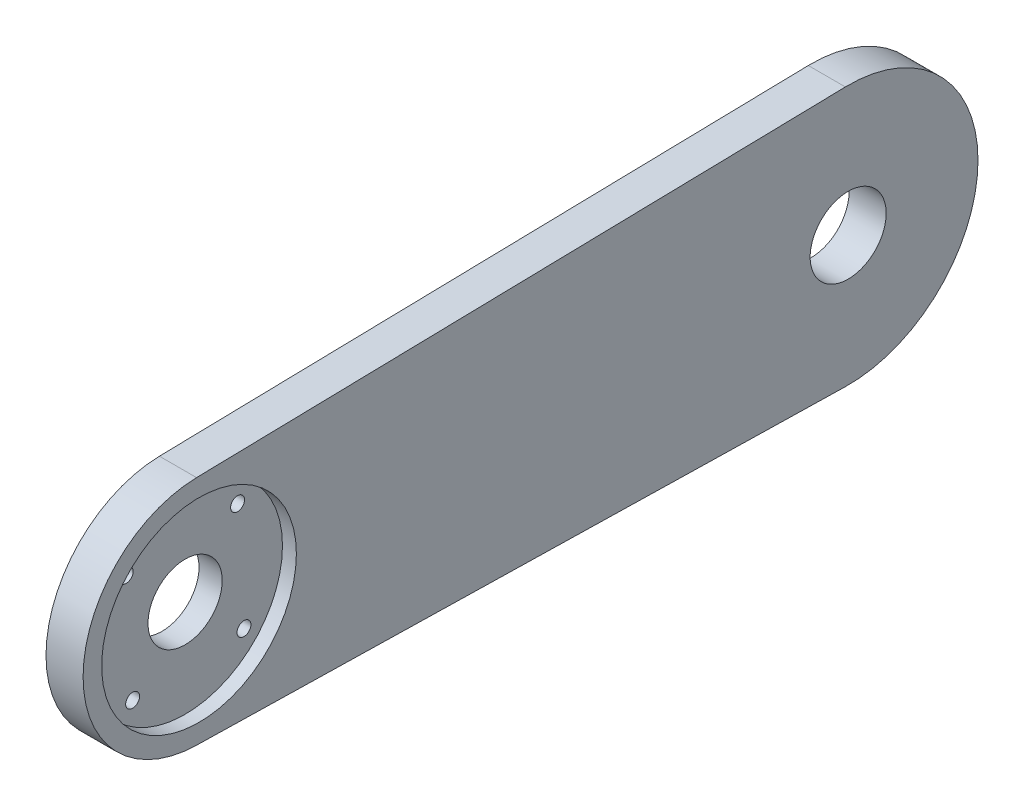
ISO-10303-21;
HEADER;
FILE_DESCRIPTION(('STEP AP214'),'2;1');
FILE_NAME('part.step','',(''),(''),'','','');
FILE_SCHEMA(('AUTOMOTIVE_DESIGN { 1 0 10303 214 1 1 1 1 }'));
ENDSEC;
DATA;
#1=APPLICATION_CONTEXT('core data for automotive mechanical design processes');
#2=APPLICATION_PROTOCOL_DEFINITION('international standard','automotive_design',2000,#1);
#3=PRODUCT_CONTEXT('',#1,'mechanical');
#4=PRODUCT('Part','Part','',(#3));
#5=PRODUCT_RELATED_PRODUCT_CATEGORY('part','',(#4));
#6=PRODUCT_DEFINITION_FORMATION('','',#4);
#7=PRODUCT_DEFINITION_CONTEXT('part definition',#1,'design');
#8=PRODUCT_DEFINITION('design','',#6,#7);
#9=PRODUCT_DEFINITION_SHAPE('','',#8);
#10=(LENGTH_UNIT() NAMED_UNIT(*) SI_UNIT(.MILLI.,.METRE.));
#11=(NAMED_UNIT(*) PLANE_ANGLE_UNIT() SI_UNIT($,.RADIAN.));
#12=(NAMED_UNIT(*) SI_UNIT($,.STERADIAN.) SOLID_ANGLE_UNIT());
#13=UNCERTAINTY_MEASURE_WITH_UNIT(LENGTH_MEASURE(1.E-05),#10,'distance_accuracy_value','');
#14=(GEOMETRIC_REPRESENTATION_CONTEXT(3) GLOBAL_UNCERTAINTY_ASSIGNED_CONTEXT((#13)) GLOBAL_UNIT_ASSIGNED_CONTEXT((#10,
#11,#12)) REPRESENTATION_CONTEXT('',''));
#15=CARTESIAN_POINT('',(0.,0.,0.));
#16=DIRECTION('',(0.,0.,1.));
#17=DIRECTION('',(1.,0.,0.));
#18=AXIS2_PLACEMENT_3D('',#15,#16,#17);
#19=CARTESIAN_POINT('',(4.,0.,70.));
#20=DIRECTION('',(-1.,0.,0.));
#21=DIRECTION('',(0.,0.,1.));
#22=AXIS2_PLACEMENT_3D('',#19,#20,#21);
#23=CYLINDRICAL_SURFACE('',#22,4.00000000000001);
#24=CARTESIAN_POINT('',(0.,0.,70.));
#25=DIRECTION('',(1.,0.,0.));
#26=DIRECTION('',(0.,0.,-1.));
#27=AXIS2_PLACEMENT_3D('',#24,#25,#26);
#28=CIRCLE('',#27,4.00000000000001);
#29=CARTESIAN_POINT('',(0.,0.,66.));
#30=VERTEX_POINT('',#29);
#31=EDGE_CURVE('E112',#30,#30,#28,.T.);
#32=ORIENTED_EDGE('',*,*,#31,.F.);
#33=EDGE_LOOP('',(#32));
#34=FACE_BOUND('',#33,.T.);
#35=CARTESIAN_POINT('',(2.5,0.,70.));
#36=DIRECTION('',(1.,0.,0.));
#37=DIRECTION('',(0.,0.,-1.));
#38=AXIS2_PLACEMENT_3D('',#35,#36,#37);
#39=CIRCLE('',#38,4.00000000000001);
#40=CARTESIAN_POINT('',(2.5,0.,66.));
#41=VERTEX_POINT('',#40);
#42=EDGE_CURVE('E109',#41,#41,#39,.T.);
#43=ORIENTED_EDGE('',*,*,#42,.T.);
#44=EDGE_LOOP('',(#43));
#45=FACE_BOUND('',#44,.T.);
#46=ADVANCED_FACE('F33',(#34,#45),#23,.F.);
#47=CARTESIAN_POINT('',(4.,0.,70.));
#48=DIRECTION('',(1.,0.,0.));
#49=DIRECTION('',(0.,0.,-1.));
#50=AXIS2_PLACEMENT_3D('',#47,#48,#49);
#51=PLANE('',#50);
#52=CARTESIAN_POINT('',(4.,0.,70.));
#53=DIRECTION('',(1.,0.,0.));
#54=DIRECTION('',(0.,0.,-1.));
#55=AXIS2_PLACEMENT_3D('',#52,#53,#54);
#56=CIRCLE('',#55,10.5);
#57=CARTESIAN_POINT('',(4.,0.,59.5));
#58=VERTEX_POINT('',#57);
#59=EDGE_CURVE('E117',#58,#58,#56,.T.);
#60=ORIENTED_EDGE('',*,*,#59,.F.);
#61=EDGE_LOOP('',(#60));
#62=FACE_BOUND('',#61,.T.);
#63=CARTESIAN_POINT('',(4.,0.,0.));
#64=DIRECTION('',(1.,0.,0.));
#65=DIRECTION('',(0.,0.,-1.));
#66=AXIS2_PLACEMENT_3D('',#63,#64,#65);
#67=CIRCLE('',#66,4.1);
#68=CARTESIAN_POINT('',(4.,0.,-4.1));
#69=VERTEX_POINT('',#68);
#70=EDGE_CURVE('E103',#69,#69,#67,.T.);
#71=ORIENTED_EDGE('',*,*,#70,.F.);
#72=EDGE_LOOP('',(#71));
#73=FACE_BOUND('',#72,.T.);
#74=CARTESIAN_POINT('',(4.,0.,70.));
#75=DIRECTION('',(1.,0.,0.));
#76=DIRECTION('',(0.,0.,-1.));
#77=AXIS2_PLACEMENT_3D('',#74,#75,#76);
#78=CIRCLE('',#77,12.5);
#79=CARTESIAN_POINT('',(4.,12.4971297725126,70.2678571428571));
#80=VERTEX_POINT('',#79);
#81=CARTESIAN_POINT('',(4.,-12.4971297725126,70.2678571428571));
#82=VERTEX_POINT('',#81);
#83=EDGE_CURVE('E87',#80,#82,#78,.T.);
#84=ORIENTED_EDGE('',*,*,#83,.T.);
#85=DIRECTION('',(0.,-0.0214285714285713,-0.999770381801007));
#86=VECTOR('',#85,1.);
#87=CARTESIAN_POINT('',(4.,-12.4971297725126,70.2678571428571));
#88=LINE('',#87,#86);
#89=CARTESIAN_POINT('',(4.,-13.9967853452141,0.300000000000001));
#90=VERTEX_POINT('',#89);
#91=EDGE_CURVE('E82',#82,#90,#88,.T.);
#92=ORIENTED_EDGE('',*,*,#91,.T.);
#93=CARTESIAN_POINT('',(4.,0.,0.));
#94=DIRECTION('',(1.,0.,0.));
#95=DIRECTION('',(0.,0.,-1.));
#96=AXIS2_PLACEMENT_3D('',#93,#94,#95);
#97=CIRCLE('',#96,14.);
#98=CARTESIAN_POINT('',(4.,13.9967853452141,0.300000000000002));
#99=VERTEX_POINT('',#98);
#100=EDGE_CURVE('E85',#90,#99,#97,.T.);
#101=ORIENTED_EDGE('',*,*,#100,.T.);
#102=DIRECTION('',(0.,-0.0214285714285716,0.999770381801007));
#103=VECTOR('',#102,1.);
#104=CARTESIAN_POINT('',(4.,12.4971297725126,70.2678571428571));
#105=LINE('',#104,#103);
#106=EDGE_CURVE('E52',#99,#80,#105,.T.);
#107=ORIENTED_EDGE('',*,*,#106,.T.);
#108=EDGE_LOOP('',(#84,#92,#101,#107));
#109=FACE_BOUND('',#108,.T.);
#110=ADVANCED_FACE('F83',(#62,#73,#109),#51,.T.);
#111=CARTESIAN_POINT('',(0.,0.,70.));
#112=DIRECTION('',(1.,0.,0.));
#113=DIRECTION('',(0.,0.,-1.));
#114=AXIS2_PLACEMENT_3D('',#111,#112,#113);
#115=PLANE('',#114);
#116=CARTESIAN_POINT('',(0.,-6.3481083902204,75.6580933065838));
#117=DIRECTION('',(-1.,0.,0.));
#118=DIRECTION('',(0.,0.,1.));
#119=AXIS2_PLACEMENT_3D('',#116,#117,#118);
#120=CIRCLE('',#119,0.749999999999999);
#121=CARTESIAN_POINT('',(0.,-6.3481083902204,76.4080933065838));
#122=VERTEX_POINT('',#121);
#123=EDGE_CURVE('E134',#122,#122,#120,.T.);
#124=ORIENTED_EDGE('',*,*,#123,.F.);
#125=EDGE_LOOP('',(#124));
#126=FACE_BOUND('',#125,.T.);
#127=CARTESIAN_POINT('',(0.,6.34810839022073,64.3419066934157));
#128=DIRECTION('',(-1.,0.,0.));
#129=DIRECTION('',(0.,0.,1.));
#130=AXIS2_PLACEMENT_3D('',#127,#128,#129);
#131=CIRCLE('',#130,0.750000000000376);
#132=CARTESIAN_POINT('',(0.,6.34810839022073,65.0919066934161));
#133=VERTEX_POINT('',#132);
#134=EDGE_CURVE('E124',#133,#133,#131,.T.);
#135=ORIENTED_EDGE('',*,*,#134,.F.);
#136=EDGE_LOOP('',(#135));
#137=FACE_BOUND('',#136,.T.);
#138=CARTESIAN_POINT('',(0.,5.65809330658422,76.3481083902203));
#139=DIRECTION('',(-1.,0.,0.));
#140=DIRECTION('',(0.,0.,1.));
#141=AXIS2_PLACEMENT_3D('',#138,#139,#140);
#142=CIRCLE('',#141,0.749999999999999);
#143=CARTESIAN_POINT('',(0.,5.65809330658422,77.0981083902203));
#144=VERTEX_POINT('',#143);
#145=EDGE_CURVE('E121',#144,#144,#142,.T.);
#146=ORIENTED_EDGE('',*,*,#145,.F.);
#147=EDGE_LOOP('',(#146));
#148=FACE_BOUND('',#147,.T.);
#149=CARTESIAN_POINT('',(0.,-5.65809330658389,63.6518916097792));
#150=DIRECTION('',(-1.,0.,0.));
#151=DIRECTION('',(0.,0.,1.));
#152=AXIS2_PLACEMENT_3D('',#149,#150,#151);
#153=CIRCLE('',#152,0.750000000000361);
#154=CARTESIAN_POINT('',(0.,-5.65809330658389,64.4018916097796));
#155=VERTEX_POINT('',#154);
#156=EDGE_CURVE('E118',#155,#155,#153,.T.);
#157=ORIENTED_EDGE('',*,*,#156,.F.);
#158=EDGE_LOOP('',(#157));
#159=FACE_BOUND('',#158,.T.);
#160=CARTESIAN_POINT('',(0.,0.,0.));
#161=DIRECTION('',(1.,0.,0.));
#162=DIRECTION('',(0.,0.,-1.));
#163=AXIS2_PLACEMENT_3D('',#160,#161,#162);
#164=CIRCLE('',#163,4.1);
#165=CARTESIAN_POINT('',(0.,0.,-4.1));
#166=VERTEX_POINT('',#165);
#167=EDGE_CURVE('E145',#166,#166,#164,.T.);
#168=ORIENTED_EDGE('',*,*,#167,.T.);
#169=EDGE_LOOP('',(#168));
#170=FACE_BOUND('',#169,.T.);
#171=CARTESIAN_POINT('',(0.,0.,70.));
#172=DIRECTION('',(1.,0.,0.));
#173=DIRECTION('',(0.,0.,-1.));
#174=AXIS2_PLACEMENT_3D('',#171,#172,#173);
#175=CIRCLE('',#174,12.5);
#176=CARTESIAN_POINT('',(0.,12.4971297725126,70.2678571428571));
#177=VERTEX_POINT('',#176);
#178=CARTESIAN_POINT('',(0.,-12.4971297725126,70.2678571428571));
#179=VERTEX_POINT('',#178);
#180=EDGE_CURVE('E100',#177,#179,#175,.T.);
#181=ORIENTED_EDGE('',*,*,#180,.F.);
#182=DIRECTION('',(0.,-0.0214285714285716,0.999770381801007));
#183=VECTOR('',#182,1.);
#184=CARTESIAN_POINT('',(0.,12.4971297725126,70.2678571428571));
#185=LINE('',#184,#183);
#186=CARTESIAN_POINT('',(0.,13.9967853452141,0.300000000000002));
#187=VERTEX_POINT('',#186);
#188=EDGE_CURVE('E75',#187,#177,#185,.T.);
#189=ORIENTED_EDGE('',*,*,#188,.F.);
#190=CARTESIAN_POINT('',(0.,0.,0.));
#191=DIRECTION('',(1.,0.,0.));
#192=DIRECTION('',(0.,0.,-1.));
#193=AXIS2_PLACEMENT_3D('',#190,#191,#192);
#194=CIRCLE('',#193,14.);
#195=CARTESIAN_POINT('',(0.,-13.9967853452141,0.300000000000001));
#196=VERTEX_POINT('',#195);
#197=EDGE_CURVE('E69',#196,#187,#194,.T.);
#198=ORIENTED_EDGE('',*,*,#197,.F.);
#199=DIRECTION('',(0.,-0.0214285714285713,-0.999770381801007));
#200=VECTOR('',#199,1.);
#201=CARTESIAN_POINT('',(0.,-12.4971297725126,70.2678571428571));
#202=LINE('',#201,#200);
#203=EDGE_CURVE('E91',#179,#196,#202,.T.);
#204=ORIENTED_EDGE('',*,*,#203,.F.);
#205=EDGE_LOOP('',(#181,#189,#198,#204));
#206=FACE_BOUND('',#205,.T.);
#207=ORIENTED_EDGE('',*,*,#31,.T.);
#208=EDGE_LOOP('',(#207));
#209=FACE_BOUND('',#208,.T.);
#210=ADVANCED_FACE('F151',(#126,#137,#148,#159,#170,#206,#209),#115,.F.);
#211=CARTESIAN_POINT('',(4.,0.,70.));
#212=DIRECTION('',(-1.,0.,0.));
#213=DIRECTION('',(0.,0.,1.));
#214=AXIS2_PLACEMENT_3D('',#211,#212,#213);
#215=CYLINDRICAL_SURFACE('',#214,12.5);
#216=ORIENTED_EDGE('',*,*,#180,.T.);
#217=DIRECTION('',(-1.,0.,0.));
#218=VECTOR('',#217,1.);
#219=CARTESIAN_POINT('',(4.,-12.4971297725126,70.2678571428571));
#220=LINE('',#219,#218);
#221=EDGE_CURVE('E11',#82,#179,#220,.T.);
#222=ORIENTED_EDGE('',*,*,#221,.F.);
#223=ORIENTED_EDGE('',*,*,#83,.F.);
#224=DIRECTION('',(-1.,0.,0.));
#225=VECTOR('',#224,1.);
#226=CARTESIAN_POINT('',(4.,12.4971297725126,70.2678571428571));
#227=LINE('',#226,#225);
#228=EDGE_CURVE('E96',#80,#177,#227,.T.);
#229=ORIENTED_EDGE('',*,*,#228,.T.);
#230=EDGE_LOOP('',(#216,#222,#223,#229));
#231=FACE_BOUND('',#230,.T.);
#232=ADVANCED_FACE('F35',(#231),#215,.T.);
#233=CARTESIAN_POINT('',(4.,-12.4971297725126,70.2678571428571));
#234=DIRECTION('',(0.,0.999770381801007,-0.0214285714285713));
#235=DIRECTION('',(0.,0.0214285714285713,0.999770381801007));
#236=AXIS2_PLACEMENT_3D('',#233,#234,#235);
#237=PLANE('',#236);
#238=ORIENTED_EDGE('',*,*,#203,.T.);
#239=DIRECTION('',(-1.,0.,0.));
#240=VECTOR('',#239,1.);
#241=CARTESIAN_POINT('',(4.,-13.9967853452141,0.300000000000001));
#242=LINE('',#241,#240);
#243=EDGE_CURVE('E43',#90,#196,#242,.T.);
#244=ORIENTED_EDGE('',*,*,#243,.F.);
#245=ORIENTED_EDGE('',*,*,#91,.F.);
#246=ORIENTED_EDGE('',*,*,#221,.T.);
#247=EDGE_LOOP('',(#238,#244,#245,#246));
#248=FACE_BOUND('',#247,.T.);
#249=ADVANCED_FACE('F90',(#248),#237,.F.);
#250=CARTESIAN_POINT('',(4.,0.,0.));
#251=DIRECTION('',(-1.,0.,0.));
#252=DIRECTION('',(0.,0.,1.));
#253=AXIS2_PLACEMENT_3D('',#250,#251,#252);
#254=CYLINDRICAL_SURFACE('',#253,14.);
#255=ORIENTED_EDGE('',*,*,#197,.T.);
#256=DIRECTION('',(-1.,0.,0.));
#257=VECTOR('',#256,1.);
#258=CARTESIAN_POINT('',(4.,13.9967853452141,0.300000000000002));
#259=LINE('',#258,#257);
#260=EDGE_CURVE('E92',#99,#187,#259,.T.);
#261=ORIENTED_EDGE('',*,*,#260,.F.);
#262=ORIENTED_EDGE('',*,*,#100,.F.);
#263=ORIENTED_EDGE('',*,*,#243,.T.);
#264=EDGE_LOOP('',(#255,#261,#262,#263));
#265=FACE_BOUND('',#264,.T.);
#266=ADVANCED_FACE('F94',(#265),#254,.T.);
#267=CARTESIAN_POINT('',(4.,12.4971297725126,70.2678571428571));
#268=DIRECTION('',(0.,-0.999770381801007,-0.0214285714285716));
#269=DIRECTION('',(0.,0.0214285714285716,-0.999770381801007));
#270=AXIS2_PLACEMENT_3D('',#267,#268,#269);
#271=PLANE('',#270);
#272=ORIENTED_EDGE('',*,*,#188,.T.);
#273=ORIENTED_EDGE('',*,*,#228,.F.);
#274=ORIENTED_EDGE('',*,*,#106,.F.);
#275=ORIENTED_EDGE('',*,*,#260,.T.);
#276=EDGE_LOOP('',(#272,#273,#274,#275));
#277=FACE_BOUND('',#276,.T.);
#278=ADVANCED_FACE('F157',(#277),#271,.F.);
#279=CARTESIAN_POINT('',(4.,0.,0.));
#280=DIRECTION('',(-1.,0.,0.));
#281=DIRECTION('',(0.,0.,1.));
#282=AXIS2_PLACEMENT_3D('',#279,#280,#281);
#283=CYLINDRICAL_SURFACE('',#282,4.1);
#284=ORIENTED_EDGE('',*,*,#70,.T.);
#285=EDGE_LOOP('',(#284));
#286=FACE_BOUND('',#285,.T.);
#287=ORIENTED_EDGE('',*,*,#167,.F.);
#288=EDGE_LOOP('',(#287));
#289=FACE_BOUND('',#288,.T.);
#290=ADVANCED_FACE('F154',(#286,#289),#283,.F.);
#291=CARTESIAN_POINT('',(2.5,0.,70.));
#292=DIRECTION('',(1.,0.,0.));
#293=DIRECTION('',(0.,0.,-1.));
#294=AXIS2_PLACEMENT_3D('',#291,#292,#293);
#295=CYLINDRICAL_SURFACE('',#294,10.5);
#296=CARTESIAN_POINT('',(2.5,0.,70.));
#297=DIRECTION('',(1.,0.,0.));
#298=DIRECTION('',(0.,0.,-1.));
#299=AXIS2_PLACEMENT_3D('',#296,#297,#298);
#300=CIRCLE('',#299,10.5);
#301=CARTESIAN_POINT('',(2.5,0.,59.5));
#302=VERTEX_POINT('',#301);
#303=EDGE_CURVE('E113',#302,#302,#300,.T.);
#304=ORIENTED_EDGE('',*,*,#303,.F.);
#305=EDGE_LOOP('',(#304));
#306=FACE_BOUND('',#305,.T.);
#307=ORIENTED_EDGE('',*,*,#59,.T.);
#308=EDGE_LOOP('',(#307));
#309=FACE_BOUND('',#308,.T.);
#310=ADVANCED_FACE('F156',(#306,#309),#295,.F.);
#311=CARTESIAN_POINT('',(2.5,0.,70.));
#312=DIRECTION('',(1.,0.,0.));
#313=DIRECTION('',(0.,0.,-1.));
#314=AXIS2_PLACEMENT_3D('',#311,#312,#313);
#315=PLANE('',#314);
#316=CARTESIAN_POINT('',(2.5,-6.3481083902204,75.6580933065838));
#317=DIRECTION('',(1.,0.,0.));
#318=DIRECTION('',(0.,0.,-1.));
#319=AXIS2_PLACEMENT_3D('',#316,#317,#318);
#320=CIRCLE('',#319,0.749999999999999);
#321=CARTESIAN_POINT('',(2.5,-6.3481083902204,74.9080933065838));
#322=VERTEX_POINT('',#321);
#323=EDGE_CURVE('E37',#322,#322,#320,.T.);
#324=ORIENTED_EDGE('',*,*,#323,.F.);
#325=EDGE_LOOP('',(#324));
#326=FACE_BOUND('',#325,.T.);
#327=CARTESIAN_POINT('',(2.5,6.34810839022073,64.3419066934157));
#328=DIRECTION('',(1.,0.,0.));
#329=DIRECTION('',(0.,0.,-1.));
#330=AXIS2_PLACEMENT_3D('',#327,#328,#329);
#331=CIRCLE('',#330,0.750000000000376);
#332=CARTESIAN_POINT('',(2.5,6.34810839022073,63.5919066934153));
#333=VERTEX_POINT('',#332);
#334=EDGE_CURVE('E122',#333,#333,#331,.T.);
#335=ORIENTED_EDGE('',*,*,#334,.F.);
#336=EDGE_LOOP('',(#335));
#337=FACE_BOUND('',#336,.T.);
#338=CARTESIAN_POINT('',(2.5,5.65809330658422,76.3481083902203));
#339=DIRECTION('',(1.,0.,0.));
#340=DIRECTION('',(0.,0.,-1.));
#341=AXIS2_PLACEMENT_3D('',#338,#339,#340);
#342=CIRCLE('',#341,0.749999999999999);
#343=CARTESIAN_POINT('',(2.5,5.65809330658422,75.5981083902203));
#344=VERTEX_POINT('',#343);
#345=EDGE_CURVE('E119',#344,#344,#342,.T.);
#346=ORIENTED_EDGE('',*,*,#345,.F.);
#347=EDGE_LOOP('',(#346));
#348=FACE_BOUND('',#347,.T.);
#349=CARTESIAN_POINT('',(2.5,-5.65809330658389,63.6518916097792));
#350=DIRECTION('',(1.,0.,0.));
#351=DIRECTION('',(0.,0.,-1.));
#352=AXIS2_PLACEMENT_3D('',#349,#350,#351);
#353=CIRCLE('',#352,0.750000000000361);
#354=CARTESIAN_POINT('',(2.5,-5.65809330658389,62.9018916097788));
#355=VERTEX_POINT('',#354);
#356=EDGE_CURVE('E114',#355,#355,#353,.T.);
#357=ORIENTED_EDGE('',*,*,#356,.F.);
#358=EDGE_LOOP('',(#357));
#359=FACE_BOUND('',#358,.T.);
#360=ORIENTED_EDGE('',*,*,#42,.F.);
#361=EDGE_LOOP('',(#360));
#362=FACE_BOUND('',#361,.T.);
#363=ORIENTED_EDGE('',*,*,#303,.T.);
#364=EDGE_LOOP('',(#363));
#365=FACE_BOUND('',#364,.T.);
#366=ADVANCED_FACE('F164',(#326,#337,#348,#359,#362,#365),#315,.T.);
#367=CARTESIAN_POINT('',(10.,-5.65809330658389,63.6518916097792));
#368=DIRECTION('',(-1.,0.,0.));
#369=DIRECTION('',(0.,0.,1.));
#370=AXIS2_PLACEMENT_3D('',#367,#368,#369);
#371=CYLINDRICAL_SURFACE('',#370,0.750000000000361);
#372=ORIENTED_EDGE('',*,*,#356,.T.);
#373=EDGE_LOOP('',(#372));
#374=FACE_BOUND('',#373,.T.);
#375=ORIENTED_EDGE('',*,*,#156,.T.);
#376=EDGE_LOOP('',(#375));
#377=FACE_BOUND('',#376,.T.);
#378=ADVANCED_FACE('F181',(#374,#377),#371,.F.);
#379=CARTESIAN_POINT('',(10.,5.65809330658422,76.3481083902203));
#380=DIRECTION('',(-1.,0.,0.));
#381=DIRECTION('',(0.,0.,1.));
#382=AXIS2_PLACEMENT_3D('',#379,#380,#381);
#383=CYLINDRICAL_SURFACE('',#382,0.749999999999999);
#384=ORIENTED_EDGE('',*,*,#345,.T.);
#385=EDGE_LOOP('',(#384));
#386=FACE_BOUND('',#385,.T.);
#387=ORIENTED_EDGE('',*,*,#145,.T.);
#388=EDGE_LOOP('',(#387));
#389=FACE_BOUND('',#388,.T.);
#390=ADVANCED_FACE('F185',(#386,#389),#383,.F.);
#391=CARTESIAN_POINT('',(10.,6.34810839022073,64.3419066934157));
#392=DIRECTION('',(-1.,0.,0.));
#393=DIRECTION('',(0.,0.,1.));
#394=AXIS2_PLACEMENT_3D('',#391,#392,#393);
#395=CYLINDRICAL_SURFACE('',#394,0.750000000000376);
#396=ORIENTED_EDGE('',*,*,#334,.T.);
#397=EDGE_LOOP('',(#396));
#398=FACE_BOUND('',#397,.T.);
#399=ORIENTED_EDGE('',*,*,#134,.T.);
#400=EDGE_LOOP('',(#399));
#401=FACE_BOUND('',#400,.T.);
#402=ADVANCED_FACE('F189',(#398,#401),#395,.F.);
#403=CARTESIAN_POINT('',(10.,-6.3481083902204,75.6580933065838));
#404=DIRECTION('',(-1.,0.,0.));
#405=DIRECTION('',(0.,0.,1.));
#406=AXIS2_PLACEMENT_3D('',#403,#404,#405);
#407=CYLINDRICAL_SURFACE('',#406,0.749999999999999);
#408=ORIENTED_EDGE('',*,*,#323,.T.);
#409=EDGE_LOOP('',(#408));
#410=FACE_BOUND('',#409,.T.);
#411=ORIENTED_EDGE('',*,*,#123,.T.);
#412=EDGE_LOOP('',(#411));
#413=FACE_BOUND('',#412,.T.);
#414=ADVANCED_FACE('F193',(#410,#413),#407,.F.);
#415=CLOSED_SHELL('',(#46,#110,#210,#232,#249,#266,#278,#290,#310,#366,#378,#390,#402,#414));
#416=MANIFOLD_SOLID_BREP('B2',#415);
#417=ADVANCED_BREP_SHAPE_REPRESENTATION('',(#18,#416),#14);
#418=SHAPE_DEFINITION_REPRESENTATION(#9,#417);
ENDSEC;
END-ISO-10303-21;
